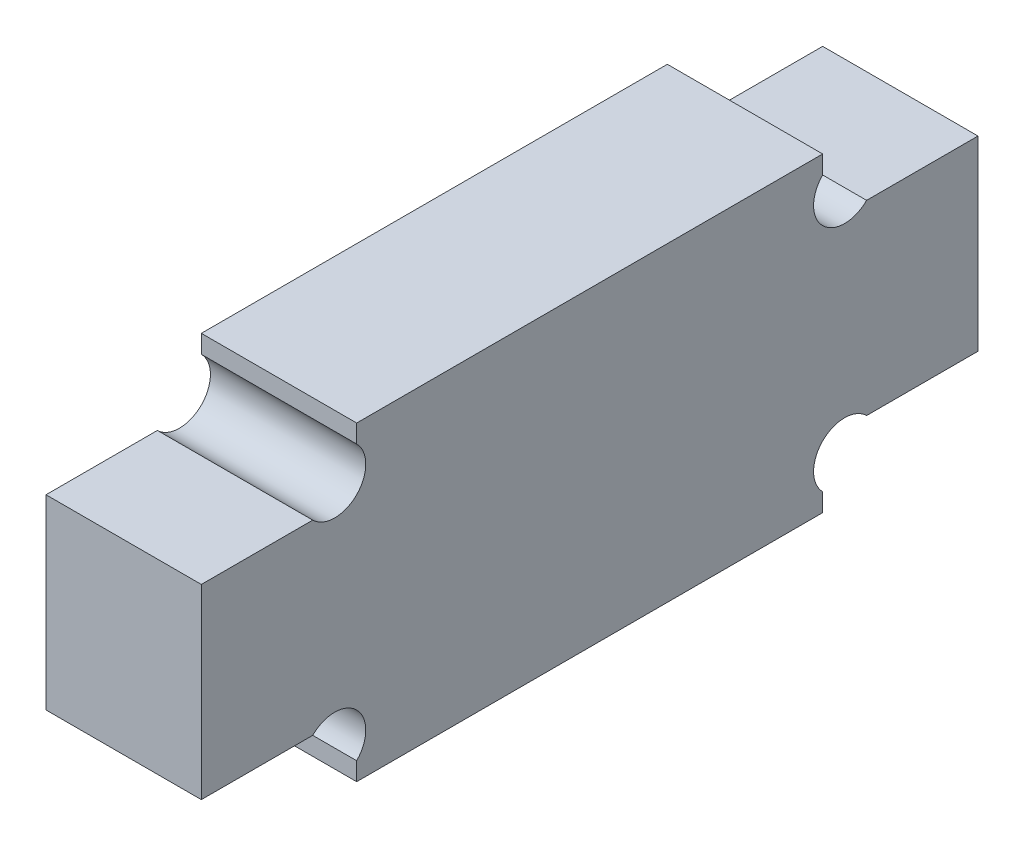
ISO-10303-21;
HEADER;
FILE_DESCRIPTION(('STEP AP214'),'2;1');
FILE_NAME('part.step','',(''),(''),'','','');
FILE_SCHEMA(('AUTOMOTIVE_DESIGN { 1 0 10303 214 1 1 1 1 }'));
ENDSEC;
DATA;
#1=APPLICATION_CONTEXT('core data for automotive mechanical design processes');
#2=APPLICATION_PROTOCOL_DEFINITION('international standard','automotive_design',2000,#1);
#3=PRODUCT_CONTEXT('',#1,'mechanical');
#4=PRODUCT('Part','Part','',(#3));
#5=PRODUCT_RELATED_PRODUCT_CATEGORY('part','',(#4));
#6=PRODUCT_DEFINITION_FORMATION('','',#4);
#7=PRODUCT_DEFINITION_CONTEXT('part definition',#1,'design');
#8=PRODUCT_DEFINITION('design','',#6,#7);
#9=PRODUCT_DEFINITION_SHAPE('','',#8);
#10=(LENGTH_UNIT() NAMED_UNIT(*) SI_UNIT(.MILLI.,.METRE.));
#11=(NAMED_UNIT(*) PLANE_ANGLE_UNIT() SI_UNIT($,.RADIAN.));
#12=(NAMED_UNIT(*) SI_UNIT($,.STERADIAN.) SOLID_ANGLE_UNIT());
#13=UNCERTAINTY_MEASURE_WITH_UNIT(LENGTH_MEASURE(1.E-05),#10,'distance_accuracy_value','');
#14=(GEOMETRIC_REPRESENTATION_CONTEXT(3) GLOBAL_UNCERTAINTY_ASSIGNED_CONTEXT((#13)) GLOBAL_UNIT_ASSIGNED_CONTEXT((#10,
#11,#12)) REPRESENTATION_CONTEXT('',''));
#15=CARTESIAN_POINT('',(0.,0.,0.));
#16=DIRECTION('',(0.,0.,1.));
#17=DIRECTION('',(1.,0.,0.));
#18=AXIS2_PLACEMENT_3D('',#15,#16,#17);
#19=CARTESIAN_POINT('',(5.,0.,0.));
#20=DIRECTION('',(0.,0.,-1.));
#21=DIRECTION('',(-1.,0.,0.));
#22=AXIS2_PLACEMENT_3D('',#19,#20,#21);
#23=PLANE('',#22);
#24=DIRECTION('',(0.,-1.,0.));
#25=VECTOR('',#24,1.);
#26=CARTESIAN_POINT('',(5.,0.,0.));
#27=LINE('',#26,#25);
#28=CARTESIAN_POINT('',(5.,8.,0.));
#29=VERTEX_POINT('',#28);
#30=CARTESIAN_POINT('',(5.,2.,0.));
#31=VERTEX_POINT('',#30);
#32=EDGE_CURVE('E211',#29,#31,#27,.T.);
#33=ORIENTED_EDGE('',*,*,#32,.F.);
#34=DIRECTION('',(-1.,0.,0.));
#35=VECTOR('',#34,1.);
#36=CARTESIAN_POINT('',(10.,8.,0.));
#37=LINE('',#36,#35);
#38=CARTESIAN_POINT('',(0.,8.,0.));
#39=VERTEX_POINT('',#38);
#40=EDGE_CURVE('E183',#29,#39,#37,.T.);
#41=ORIENTED_EDGE('',*,*,#40,.T.);
#42=DIRECTION('',(0.,-1.,0.));
#43=VECTOR('',#42,1.);
#44=CARTESIAN_POINT('',(0.,0.,0.));
#45=LINE('',#44,#43);
#46=CARTESIAN_POINT('',(0.,2.,0.));
#47=VERTEX_POINT('',#46);
#48=EDGE_CURVE('E210',#39,#47,#45,.T.);
#49=ORIENTED_EDGE('',*,*,#48,.T.);
#50=DIRECTION('',(-1.,0.,0.));
#51=VECTOR('',#50,1.);
#52=CARTESIAN_POINT('',(10.,2.,0.));
#53=LINE('',#52,#51);
#54=EDGE_CURVE('E200',#31,#47,#53,.T.);
#55=ORIENTED_EDGE('',*,*,#54,.F.);
#56=EDGE_LOOP('',(#33,#41,#49,#55));
#57=FACE_BOUND('',#56,.T.);
#58=ADVANCED_FACE('F33',(#57),#23,.F.);
#59=CARTESIAN_POINT('',(5.,0.,0.));
#60=DIRECTION('',(0.,1.,0.));
#61=DIRECTION('',(0.,0.,1.));
#62=AXIS2_PLACEMENT_3D('',#59,#60,#61);
#63=PLANE('',#62);
#64=DIRECTION('',(0.,0.,-1.));
#65=VECTOR('',#64,1.);
#66=CARTESIAN_POINT('',(0.,0.,0.));
#67=LINE('',#66,#65);
#68=CARTESIAN_POINT('',(0.,0.,-5.));
#69=VERTEX_POINT('',#68);
#70=CARTESIAN_POINT('',(0.,0.,-20.));
#71=VERTEX_POINT('',#70);
#72=EDGE_CURVE('E223',#69,#71,#67,.T.);
#73=ORIENTED_EDGE('',*,*,#72,.T.);
#74=DIRECTION('',(-1.,0.,0.));
#75=VECTOR('',#74,1.);
#76=CARTESIAN_POINT('',(10.,0.,-20.));
#77=LINE('',#76,#75);
#78=CARTESIAN_POINT('',(5.,0.,-20.));
#79=VERTEX_POINT('',#78);
#80=EDGE_CURVE('E245',#79,#71,#77,.T.);
#81=ORIENTED_EDGE('',*,*,#80,.F.);
#82=DIRECTION('',(0.,0.,-1.));
#83=VECTOR('',#82,1.);
#84=CARTESIAN_POINT('',(5.,0.,0.));
#85=LINE('',#84,#83);
#86=CARTESIAN_POINT('',(5.,0.,-5.));
#87=VERTEX_POINT('',#86);
#88=EDGE_CURVE('E213',#87,#79,#85,.T.);
#89=ORIENTED_EDGE('',*,*,#88,.F.);
#90=DIRECTION('',(-1.,0.,0.));
#91=VECTOR('',#90,1.);
#92=CARTESIAN_POINT('',(10.,0.,-5.));
#93=LINE('',#92,#91);
#94=EDGE_CURVE('E199',#87,#69,#93,.T.);
#95=ORIENTED_EDGE('',*,*,#94,.T.);
#96=EDGE_LOOP('',(#73,#81,#89,#95));
#97=FACE_BOUND('',#96,.T.);
#98=ADVANCED_FACE('F314',(#97),#63,.F.);
#99=CARTESIAN_POINT('',(5.,0.,-25.));
#100=DIRECTION('',(0.,0.,1.));
#101=DIRECTION('',(1.,0.,0.));
#102=AXIS2_PLACEMENT_3D('',#99,#100,#101);
#103=PLANE('',#102);
#104=DIRECTION('',(0.,1.,0.));
#105=VECTOR('',#104,1.);
#106=CARTESIAN_POINT('',(5.,0.,-25.));
#107=LINE('',#106,#105);
#108=CARTESIAN_POINT('',(5.,2.,-25.));
#109=VERTEX_POINT('',#108);
#110=CARTESIAN_POINT('',(5.,8.,-25.));
#111=VERTEX_POINT('',#110);
#112=EDGE_CURVE('E217',#109,#111,#107,.T.);
#113=ORIENTED_EDGE('',*,*,#112,.F.);
#114=DIRECTION('',(-1.,0.,0.));
#115=VECTOR('',#114,1.);
#116=CARTESIAN_POINT('',(10.,2.,-25.));
#117=LINE('',#116,#115);
#118=CARTESIAN_POINT('',(0.,2.,-25.));
#119=VERTEX_POINT('',#118);
#120=EDGE_CURVE('E243',#109,#119,#117,.T.);
#121=ORIENTED_EDGE('',*,*,#120,.T.);
#122=DIRECTION('',(0.,1.,0.));
#123=VECTOR('',#122,1.);
#124=CARTESIAN_POINT('',(0.,0.,-25.));
#125=LINE('',#124,#123);
#126=CARTESIAN_POINT('',(0.,8.,-25.));
#127=VERTEX_POINT('',#126);
#128=EDGE_CURVE('E226',#119,#127,#125,.T.);
#129=ORIENTED_EDGE('',*,*,#128,.T.);
#130=DIRECTION('',(-1.,0.,0.));
#131=VECTOR('',#130,1.);
#132=CARTESIAN_POINT('',(10.,8.,-25.));
#133=LINE('',#132,#131);
#134=EDGE_CURVE('E162',#111,#127,#133,.T.);
#135=ORIENTED_EDGE('',*,*,#134,.F.);
#136=EDGE_LOOP('',(#113,#121,#129,#135));
#137=FACE_BOUND('',#136,.T.);
#138=ADVANCED_FACE('F323',(#137),#103,.F.);
#139=CARTESIAN_POINT('',(5.,10.,0.));
#140=DIRECTION('',(0.,-1.,0.));
#141=DIRECTION('',(0.,0.,-1.));
#142=AXIS2_PLACEMENT_3D('',#139,#140,#141);
#143=PLANE('',#142);
#144=DIRECTION('',(0.,0.,1.));
#145=VECTOR('',#144,1.);
#146=CARTESIAN_POINT('',(5.,10.,0.));
#147=LINE('',#146,#145);
#148=CARTESIAN_POINT('',(5.,10.,-20.));
#149=VERTEX_POINT('',#148);
#150=CARTESIAN_POINT('',(5.,10.,-5.));
#151=VERTEX_POINT('',#150);
#152=EDGE_CURVE('E219',#149,#151,#147,.T.);
#153=ORIENTED_EDGE('',*,*,#152,.F.);
#154=DIRECTION('',(-1.,0.,0.));
#155=VECTOR('',#154,1.);
#156=CARTESIAN_POINT('',(10.,10.,-20.));
#157=LINE('',#156,#155);
#158=CARTESIAN_POINT('',(0.,10.,-20.));
#159=VERTEX_POINT('',#158);
#160=EDGE_CURVE('E170',#149,#159,#157,.T.);
#161=ORIENTED_EDGE('',*,*,#160,.T.);
#162=DIRECTION('',(0.,0.,1.));
#163=VECTOR('',#162,1.);
#164=CARTESIAN_POINT('',(0.,10.,0.));
#165=LINE('',#164,#163);
#166=CARTESIAN_POINT('',(0.,10.,-5.));
#167=VERTEX_POINT('',#166);
#168=EDGE_CURVE('E214',#159,#167,#165,.T.);
#169=ORIENTED_EDGE('',*,*,#168,.T.);
#170=DIRECTION('',(-1.,0.,0.));
#171=VECTOR('',#170,1.);
#172=CARTESIAN_POINT('',(10.,10.,-5.));
#173=LINE('',#172,#171);
#174=EDGE_CURVE('E184',#151,#167,#173,.T.);
#175=ORIENTED_EDGE('',*,*,#174,.F.);
#176=EDGE_LOOP('',(#153,#161,#169,#175));
#177=FACE_BOUND('',#176,.T.);
#178=ADVANCED_FACE('F282',(#177),#143,.F.);
#179=CARTESIAN_POINT('',(5.,0.,0.));
#180=DIRECTION('',(-1.,0.,0.));
#181=DIRECTION('',(0.,0.,1.));
#182=AXIS2_PLACEMENT_3D('',#179,#180,#181);
#183=PLANE('',#182);
#184=DIRECTION('',(0.,0.,1.));
#185=VECTOR('',#184,1.);
#186=CARTESIAN_POINT('',(5.,8.,0.));
#187=LINE('',#186,#185);
#188=CARTESIAN_POINT('',(5.,8.,-21.4142135623731));
#189=VERTEX_POINT('',#188);
#190=EDGE_CURVE('E173',#111,#189,#187,.T.);
#191=ORIENTED_EDGE('',*,*,#190,.T.);
#192=CARTESIAN_POINT('',(5.,8.70710678118654,-20.7071067811866));
#193=DIRECTION('',(-1.,0.,0.));
#194=DIRECTION('',(0.,0.,1.));
#195=AXIS2_PLACEMENT_3D('',#192,#193,#194);
#196=CIRCLE('',#195,0.99999999999998);
#197=CARTESIAN_POINT('',(5.,9.41421356237306,-20.));
#198=VERTEX_POINT('',#197);
#199=EDGE_CURVE('E47',#189,#198,#196,.T.);
#200=ORIENTED_EDGE('',*,*,#199,.T.);
#201=DIRECTION('',(0.,1.,0.));
#202=VECTOR('',#201,1.);
#203=CARTESIAN_POINT('',(5.,0.,-20.));
#204=LINE('',#203,#202);
#205=EDGE_CURVE('E176',#198,#149,#204,.T.);
#206=ORIENTED_EDGE('',*,*,#205,.T.);
#207=ORIENTED_EDGE('',*,*,#152,.T.);
#208=DIRECTION('',(0.,-1.,0.));
#209=VECTOR('',#208,1.);
#210=CARTESIAN_POINT('',(5.,0.,-5.));
#211=LINE('',#210,#209);
#212=CARTESIAN_POINT('',(5.,9.41421356237306,-5.));
#213=VERTEX_POINT('',#212);
#214=EDGE_CURVE('E191',#151,#213,#211,.T.);
#215=ORIENTED_EDGE('',*,*,#214,.T.);
#216=CARTESIAN_POINT('',(5.,8.70710678118654,-4.29289321881345));
#217=DIRECTION('',(-1.,0.,0.));
#218=DIRECTION('',(0.,0.,1.));
#219=AXIS2_PLACEMENT_3D('',#216,#217,#218);
#220=CIRCLE('',#219,0.999999999999982);
#221=CARTESIAN_POINT('',(5.,8.,-3.58578643762692));
#222=VERTEX_POINT('',#221);
#223=EDGE_CURVE('E252',#213,#222,#220,.T.);
#224=ORIENTED_EDGE('',*,*,#223,.T.);
#225=DIRECTION('',(0.,0.,1.));
#226=VECTOR('',#225,1.);
#227=CARTESIAN_POINT('',(5.,8.,0.));
#228=LINE('',#227,#226);
#229=EDGE_CURVE('E187',#222,#29,#228,.T.);
#230=ORIENTED_EDGE('',*,*,#229,.T.);
#231=ORIENTED_EDGE('',*,*,#32,.T.);
#232=DIRECTION('',(0.,0.,-1.));
#233=VECTOR('',#232,1.);
#234=CARTESIAN_POINT('',(5.,2.,0.));
#235=LINE('',#234,#233);
#236=CARTESIAN_POINT('',(5.,2.,-3.58578643762691));
#237=VERTEX_POINT('',#236);
#238=EDGE_CURVE('E203',#31,#237,#235,.T.);
#239=ORIENTED_EDGE('',*,*,#238,.T.);
#240=CARTESIAN_POINT('',(5.,1.29289321881345,-4.29289321881345));
#241=DIRECTION('',(-1.,0.,0.));
#242=DIRECTION('',(0.,0.,1.));
#243=AXIS2_PLACEMENT_3D('',#240,#241,#242);
#244=CIRCLE('',#243,1.);
#245=CARTESIAN_POINT('',(5.,0.585786437626902,-5.));
#246=VERTEX_POINT('',#245);
#247=EDGE_CURVE('E262',#237,#246,#244,.T.);
#248=ORIENTED_EDGE('',*,*,#247,.T.);
#249=DIRECTION('',(0.,-1.,0.));
#250=VECTOR('',#249,1.);
#251=CARTESIAN_POINT('',(5.,0.,-5.));
#252=LINE('',#251,#250);
#253=EDGE_CURVE('E208',#246,#87,#252,.T.);
#254=ORIENTED_EDGE('',*,*,#253,.T.);
#255=ORIENTED_EDGE('',*,*,#88,.T.);
#256=DIRECTION('',(0.,1.,0.));
#257=VECTOR('',#256,1.);
#258=CARTESIAN_POINT('',(5.,0.,-20.));
#259=LINE('',#258,#257);
#260=CARTESIAN_POINT('',(5.,0.585786437626907,-20.));
#261=VERTEX_POINT('',#260);
#262=EDGE_CURVE('E166',#79,#261,#259,.T.);
#263=ORIENTED_EDGE('',*,*,#262,.T.);
#264=CARTESIAN_POINT('',(5.,1.29289321881345,-20.7071067811865));
#265=DIRECTION('',(-1.,0.,0.));
#266=DIRECTION('',(0.,0.,1.));
#267=AXIS2_PLACEMENT_3D('',#264,#265,#266);
#268=CIRCLE('',#267,0.999999999999998);
#269=CARTESIAN_POINT('',(5.,2.,-21.4142135623731));
#270=VERTEX_POINT('',#269);
#271=EDGE_CURVE('E54',#261,#270,#268,.T.);
#272=ORIENTED_EDGE('',*,*,#271,.T.);
#273=DIRECTION('',(0.,0.,-1.));
#274=VECTOR('',#273,1.);
#275=CARTESIAN_POINT('',(5.,2.,0.));
#276=LINE('',#275,#274);
#277=EDGE_CURVE('E163',#270,#109,#276,.T.);
#278=ORIENTED_EDGE('',*,*,#277,.T.);
#279=ORIENTED_EDGE('',*,*,#112,.T.);
#280=EDGE_LOOP('',(#191,#200,#206,#207,#215,#224,#230,#231,#239,#248,#254,#255,#263,#272,#278,#279));
#281=FACE_BOUND('',#280,.T.);
#282=ADVANCED_FACE('F241',(#281),#183,.F.);
#283=CARTESIAN_POINT('',(0.,0.,0.));
#284=DIRECTION('',(-1.,0.,0.));
#285=DIRECTION('',(0.,0.,1.));
#286=AXIS2_PLACEMENT_3D('',#283,#284,#285);
#287=PLANE('',#286);
#288=CARTESIAN_POINT('',(0.,8.70710678118654,-20.7071067811866));
#289=DIRECTION('',(-1.,0.,0.));
#290=DIRECTION('',(0.,0.,-1.));
#291=AXIS2_PLACEMENT_3D('',#288,#289,#290);
#292=CIRCLE('',#291,0.99999999999998);
#293=CARTESIAN_POINT('',(0.,8.,-21.4142135623731));
#294=VERTEX_POINT('',#293);
#295=CARTESIAN_POINT('',(0.,9.41421356237306,-20.));
#296=VERTEX_POINT('',#295);
#297=EDGE_CURVE('E146',#294,#296,#292,.T.);
#298=ORIENTED_EDGE('',*,*,#297,.F.);
#299=DIRECTION('',(0.,0.,1.));
#300=VECTOR('',#299,1.);
#301=CARTESIAN_POINT('',(0.,8.,-20.));
#302=LINE('',#301,#300);
#303=EDGE_CURVE('E150',#127,#294,#302,.T.);
#304=ORIENTED_EDGE('',*,*,#303,.F.);
#305=ORIENTED_EDGE('',*,*,#128,.F.);
#306=DIRECTION('',(0.,0.,-1.));
#307=VECTOR('',#306,1.);
#308=CARTESIAN_POINT('',(0.,2.,-20.));
#309=LINE('',#308,#307);
#310=CARTESIAN_POINT('',(0.,2.,-21.4142135623731));
#311=VERTEX_POINT('',#310);
#312=EDGE_CURVE('E248',#311,#119,#309,.T.);
#313=ORIENTED_EDGE('',*,*,#312,.F.);
#314=CARTESIAN_POINT('',(0.,1.29289321881345,-20.7071067811865));
#315=DIRECTION('',(-1.,0.,0.));
#316=DIRECTION('',(0.,0.,-1.));
#317=AXIS2_PLACEMENT_3D('',#314,#315,#316);
#318=CIRCLE('',#317,0.999999999999998);
#319=CARTESIAN_POINT('',(0.,0.585786437626907,-20.));
#320=VERTEX_POINT('',#319);
#321=EDGE_CURVE('E271',#320,#311,#318,.T.);
#322=ORIENTED_EDGE('',*,*,#321,.F.);
#323=DIRECTION('',(0.,1.,0.));
#324=VECTOR('',#323,1.);
#325=CARTESIAN_POINT('',(0.,0.,-20.));
#326=LINE('',#325,#324);
#327=EDGE_CURVE('E239',#71,#320,#326,.T.);
#328=ORIENTED_EDGE('',*,*,#327,.F.);
#329=ORIENTED_EDGE('',*,*,#72,.F.);
#330=DIRECTION('',(0.,-1.,0.));
#331=VECTOR('',#330,1.);
#332=CARTESIAN_POINT('',(0.,0.,-5.));
#333=LINE('',#332,#331);
#334=CARTESIAN_POINT('',(0.,0.585786437626902,-5.));
#335=VERTEX_POINT('',#334);
#336=EDGE_CURVE('E194',#335,#69,#333,.T.);
#337=ORIENTED_EDGE('',*,*,#336,.F.);
#338=CARTESIAN_POINT('',(0.,1.29289321881345,-4.29289321881345));
#339=DIRECTION('',(-1.,0.,0.));
#340=DIRECTION('',(0.,0.,1.));
#341=AXIS2_PLACEMENT_3D('',#338,#339,#340);
#342=CIRCLE('',#341,1.);
#343=CARTESIAN_POINT('',(0.,2.,-3.58578643762691));
#344=VERTEX_POINT('',#343);
#345=EDGE_CURVE('E265',#344,#335,#342,.T.);
#346=ORIENTED_EDGE('',*,*,#345,.F.);
#347=DIRECTION('',(0.,0.,-1.));
#348=VECTOR('',#347,1.);
#349=CARTESIAN_POINT('',(0.,2.,-5.));
#350=LINE('',#349,#348);
#351=EDGE_CURVE('E196',#47,#344,#350,.T.);
#352=ORIENTED_EDGE('',*,*,#351,.F.);
#353=ORIENTED_EDGE('',*,*,#48,.F.);
#354=DIRECTION('',(0.,0.,1.));
#355=VECTOR('',#354,1.);
#356=CARTESIAN_POINT('',(0.,8.,-5.));
#357=LINE('',#356,#355);
#358=CARTESIAN_POINT('',(0.,8.,-3.58578643762692));
#359=VERTEX_POINT('',#358);
#360=EDGE_CURVE('E181',#359,#39,#357,.T.);
#361=ORIENTED_EDGE('',*,*,#360,.F.);
#362=CARTESIAN_POINT('',(0.,8.70710678118654,-4.29289321881345));
#363=DIRECTION('',(-1.,0.,0.));
#364=DIRECTION('',(0.,0.,1.));
#365=AXIS2_PLACEMENT_3D('',#362,#363,#364);
#366=CIRCLE('',#365,0.999999999999982);
#367=CARTESIAN_POINT('',(0.,9.41421356237306,-5.));
#368=VERTEX_POINT('',#367);
#369=EDGE_CURVE('E256',#368,#359,#366,.T.);
#370=ORIENTED_EDGE('',*,*,#369,.F.);
#371=DIRECTION('',(0.,-1.,0.));
#372=VECTOR('',#371,1.);
#373=CARTESIAN_POINT('',(0.,10.,-5.));
#374=LINE('',#373,#372);
#375=EDGE_CURVE('E178',#167,#368,#374,.T.);
#376=ORIENTED_EDGE('',*,*,#375,.F.);
#377=ORIENTED_EDGE('',*,*,#168,.F.);
#378=DIRECTION('',(0.,1.,0.));
#379=VECTOR('',#378,1.);
#380=CARTESIAN_POINT('',(0.,10.,-20.));
#381=LINE('',#380,#379);
#382=EDGE_CURVE('E152',#296,#159,#381,.T.);
#383=ORIENTED_EDGE('',*,*,#382,.F.);
#384=EDGE_LOOP('',(#298,#304,#305,#313,#322,#328,#329,#337,#346,#352,#353,#361,#370,#376,#377,#383));
#385=FACE_BOUND('',#384,.T.);
#386=ADVANCED_FACE('F147',(#385),#287,.T.);
#387=CARTESIAN_POINT('',(10.,0.,-5.));
#388=DIRECTION('',(0.,0.,-1.));
#389=DIRECTION('',(-1.,0.,0.));
#390=AXIS2_PLACEMENT_3D('',#387,#388,#389);
#391=PLANE('',#390);
#392=ORIENTED_EDGE('',*,*,#253,.F.);
#393=DIRECTION('',(-1.,0.,0.));
#394=VECTOR('',#393,1.);
#395=CARTESIAN_POINT('',(10.,0.585786437626902,-5.));
#396=LINE('',#395,#394);
#397=EDGE_CURVE('E259',#246,#335,#396,.T.);
#398=ORIENTED_EDGE('',*,*,#397,.T.);
#399=ORIENTED_EDGE('',*,*,#336,.T.);
#400=ORIENTED_EDGE('',*,*,#94,.F.);
#401=EDGE_LOOP('',(#392,#398,#399,#400));
#402=FACE_BOUND('',#401,.T.);
#403=ADVANCED_FACE('F310',(#402),#391,.F.);
#404=CARTESIAN_POINT('',(10.,2.,-5.));
#405=DIRECTION('',(0.,1.,0.));
#406=DIRECTION('',(0.,0.,1.));
#407=AXIS2_PLACEMENT_3D('',#404,#405,#406);
#408=PLANE('',#407);
#409=ORIENTED_EDGE('',*,*,#351,.T.);
#410=DIRECTION('',(-1.,0.,0.));
#411=VECTOR('',#410,1.);
#412=CARTESIAN_POINT('',(10.,2.,-3.58578643762691));
#413=LINE('',#412,#411);
#414=EDGE_CURVE('E231',#344,#237,#413,.F.);
#415=ORIENTED_EDGE('',*,*,#414,.T.);
#416=ORIENTED_EDGE('',*,*,#238,.F.);
#417=ORIENTED_EDGE('',*,*,#54,.T.);
#418=EDGE_LOOP('',(#409,#415,#416,#417));
#419=FACE_BOUND('',#418,.T.);
#420=ADVANCED_FACE('F303',(#419),#408,.F.);
#421=CARTESIAN_POINT('',(10.,10.,-5.));
#422=DIRECTION('',(0.,0.,-1.));
#423=DIRECTION('',(-1.,0.,0.));
#424=AXIS2_PLACEMENT_3D('',#421,#422,#423);
#425=PLANE('',#424);
#426=ORIENTED_EDGE('',*,*,#375,.T.);
#427=DIRECTION('',(-1.,0.,0.));
#428=VECTOR('',#427,1.);
#429=CARTESIAN_POINT('',(10.,9.41421356237306,-5.));
#430=LINE('',#429,#428);
#431=EDGE_CURVE('E253',#368,#213,#430,.F.);
#432=ORIENTED_EDGE('',*,*,#431,.T.);
#433=ORIENTED_EDGE('',*,*,#214,.F.);
#434=ORIENTED_EDGE('',*,*,#174,.T.);
#435=EDGE_LOOP('',(#426,#432,#433,#434));
#436=FACE_BOUND('',#435,.T.);
#437=ADVANCED_FACE('F285',(#436),#425,.F.);
#438=CARTESIAN_POINT('',(10.,8.,-5.));
#439=DIRECTION('',(0.,-1.,0.));
#440=DIRECTION('',(0.,0.,-1.));
#441=AXIS2_PLACEMENT_3D('',#438,#439,#440);
#442=PLANE('',#441);
#443=ORIENTED_EDGE('',*,*,#229,.F.);
#444=DIRECTION('',(-1.,0.,0.));
#445=VECTOR('',#444,1.);
#446=CARTESIAN_POINT('',(10.,8.,-3.58578643762692));
#447=LINE('',#446,#445);
#448=EDGE_CURVE('E221',#222,#359,#447,.T.);
#449=ORIENTED_EDGE('',*,*,#448,.T.);
#450=ORIENTED_EDGE('',*,*,#360,.T.);
#451=ORIENTED_EDGE('',*,*,#40,.F.);
#452=EDGE_LOOP('',(#443,#449,#450,#451));
#453=FACE_BOUND('',#452,.T.);
#454=ADVANCED_FACE('F297',(#453),#442,.F.);
#455=CARTESIAN_POINT('',(10.,10.,-20.));
#456=DIRECTION('',(0.,0.,1.));
#457=DIRECTION('',(1.,0.,0.));
#458=AXIS2_PLACEMENT_3D('',#455,#456,#457);
#459=PLANE('',#458);
#460=ORIENTED_EDGE('',*,*,#205,.F.);
#461=DIRECTION('',(-1.,0.,0.));
#462=VECTOR('',#461,1.);
#463=CARTESIAN_POINT('',(10.,9.41421356237306,-20.));
#464=LINE('',#463,#462);
#465=EDGE_CURVE('E273',#198,#296,#464,.T.);
#466=ORIENTED_EDGE('',*,*,#465,.T.);
#467=ORIENTED_EDGE('',*,*,#382,.T.);
#468=ORIENTED_EDGE('',*,*,#160,.F.);
#469=EDGE_LOOP('',(#460,#466,#467,#468));
#470=FACE_BOUND('',#469,.T.);
#471=ADVANCED_FACE('F278',(#470),#459,.F.);
#472=CARTESIAN_POINT('',(10.,8.,-20.));
#473=DIRECTION('',(0.,-1.,0.));
#474=DIRECTION('',(0.,0.,-1.));
#475=AXIS2_PLACEMENT_3D('',#472,#473,#474);
#476=PLANE('',#475);
#477=ORIENTED_EDGE('',*,*,#303,.T.);
#478=DIRECTION('',(-1.,0.,0.));
#479=VECTOR('',#478,1.);
#480=CARTESIAN_POINT('',(10.,8.,-21.4142135623731));
#481=LINE('',#480,#479);
#482=EDGE_CURVE('E11',#294,#189,#481,.F.);
#483=ORIENTED_EDGE('',*,*,#482,.T.);
#484=ORIENTED_EDGE('',*,*,#190,.F.);
#485=ORIENTED_EDGE('',*,*,#134,.T.);
#486=EDGE_LOOP('',(#477,#483,#484,#485));
#487=FACE_BOUND('',#486,.T.);
#488=ADVANCED_FACE('F160',(#487),#476,.F.);
#489=CARTESIAN_POINT('',(10.,2.,-20.));
#490=DIRECTION('',(0.,1.,0.));
#491=DIRECTION('',(0.,0.,1.));
#492=AXIS2_PLACEMENT_3D('',#489,#490,#491);
#493=PLANE('',#492);
#494=ORIENTED_EDGE('',*,*,#277,.F.);
#495=DIRECTION('',(-1.,0.,0.));
#496=VECTOR('',#495,1.);
#497=CARTESIAN_POINT('',(10.,2.,-21.4142135623731));
#498=LINE('',#497,#496);
#499=EDGE_CURVE('E267',#270,#311,#498,.T.);
#500=ORIENTED_EDGE('',*,*,#499,.T.);
#501=ORIENTED_EDGE('',*,*,#312,.T.);
#502=ORIENTED_EDGE('',*,*,#120,.F.);
#503=EDGE_LOOP('',(#494,#500,#501,#502));
#504=FACE_BOUND('',#503,.T.);
#505=ADVANCED_FACE('F319',(#504),#493,.F.);
#506=CARTESIAN_POINT('',(10.,0.,-20.));
#507=DIRECTION('',(0.,0.,1.));
#508=DIRECTION('',(1.,0.,0.));
#509=AXIS2_PLACEMENT_3D('',#506,#507,#508);
#510=PLANE('',#509);
#511=ORIENTED_EDGE('',*,*,#327,.T.);
#512=DIRECTION('',(-1.,0.,0.));
#513=VECTOR('',#512,1.);
#514=CARTESIAN_POINT('',(10.,0.585786437626907,-20.));
#515=LINE('',#514,#513);
#516=EDGE_CURVE('E40',#320,#261,#515,.F.);
#517=ORIENTED_EDGE('',*,*,#516,.T.);
#518=ORIENTED_EDGE('',*,*,#262,.F.);
#519=ORIENTED_EDGE('',*,*,#80,.T.);
#520=EDGE_LOOP('',(#511,#517,#518,#519));
#521=FACE_BOUND('',#520,.T.);
#522=ADVANCED_FACE('F236',(#521),#510,.F.);
#523=CARTESIAN_POINT('',(10.,8.70710678118654,-4.29289321881345));
#524=DIRECTION('',(-1.,0.,0.));
#525=DIRECTION('',(0.,0.,1.));
#526=AXIS2_PLACEMENT_3D('',#523,#524,#525);
#527=CYLINDRICAL_SURFACE('',#526,0.999999999999982);
#528=ORIENTED_EDGE('',*,*,#431,.F.);
#529=ORIENTED_EDGE('',*,*,#369,.T.);
#530=ORIENTED_EDGE('',*,*,#448,.F.);
#531=ORIENTED_EDGE('',*,*,#223,.F.);
#532=EDGE_LOOP('',(#528,#529,#530,#531));
#533=FACE_BOUND('',#532,.T.);
#534=ADVANCED_FACE('F289',(#533),#527,.F.);
#535=CARTESIAN_POINT('',(10.,1.29289321881345,-4.29289321881345));
#536=DIRECTION('',(-1.,0.,0.));
#537=DIRECTION('',(0.,0.,1.));
#538=AXIS2_PLACEMENT_3D('',#535,#536,#537);
#539=CYLINDRICAL_SURFACE('',#538,1.);
#540=ORIENTED_EDGE('',*,*,#247,.F.);
#541=ORIENTED_EDGE('',*,*,#414,.F.);
#542=ORIENTED_EDGE('',*,*,#345,.T.);
#543=ORIENTED_EDGE('',*,*,#397,.F.);
#544=EDGE_LOOP('',(#540,#541,#542,#543));
#545=FACE_BOUND('',#544,.T.);
#546=ADVANCED_FACE('F306',(#545),#539,.F.);
#547=CARTESIAN_POINT('',(10.,1.29289321881345,-20.7071067811865));
#548=DIRECTION('',(-1.,0.,0.));
#549=DIRECTION('',(0.,0.,1.));
#550=AXIS2_PLACEMENT_3D('',#547,#548,#549);
#551=CYLINDRICAL_SURFACE('',#550,0.999999999999998);
#552=ORIENTED_EDGE('',*,*,#271,.F.);
#553=ORIENTED_EDGE('',*,*,#516,.F.);
#554=ORIENTED_EDGE('',*,*,#321,.T.);
#555=ORIENTED_EDGE('',*,*,#499,.F.);
#556=EDGE_LOOP('',(#552,#553,#554,#555));
#557=FACE_BOUND('',#556,.T.);
#558=ADVANCED_FACE('F316',(#557),#551,.F.);
#559=CARTESIAN_POINT('',(10.,8.70710678118654,-20.7071067811866));
#560=DIRECTION('',(-1.,0.,0.));
#561=DIRECTION('',(0.,0.,1.));
#562=AXIS2_PLACEMENT_3D('',#559,#560,#561);
#563=CYLINDRICAL_SURFACE('',#562,0.99999999999998);
#564=ORIENTED_EDGE('',*,*,#199,.F.);
#565=ORIENTED_EDGE('',*,*,#482,.F.);
#566=ORIENTED_EDGE('',*,*,#297,.T.);
#567=ORIENTED_EDGE('',*,*,#465,.F.);
#568=EDGE_LOOP('',(#564,#565,#566,#567));
#569=FACE_BOUND('',#568,.T.);
#570=ADVANCED_FACE('F155',(#569),#563,.F.);
#571=CLOSED_SHELL('',(#58,#98,#138,#178,#282,#386,#403,#420,#437,#454,#471,#488,#505,#522,#534,
#546,#558,#570));
#572=MANIFOLD_SOLID_BREP('B2',#571);
#573=ADVANCED_BREP_SHAPE_REPRESENTATION('',(#18,#572),#14);
#574=SHAPE_DEFINITION_REPRESENTATION(#9,#573);
ENDSEC;
END-ISO-10303-21;
